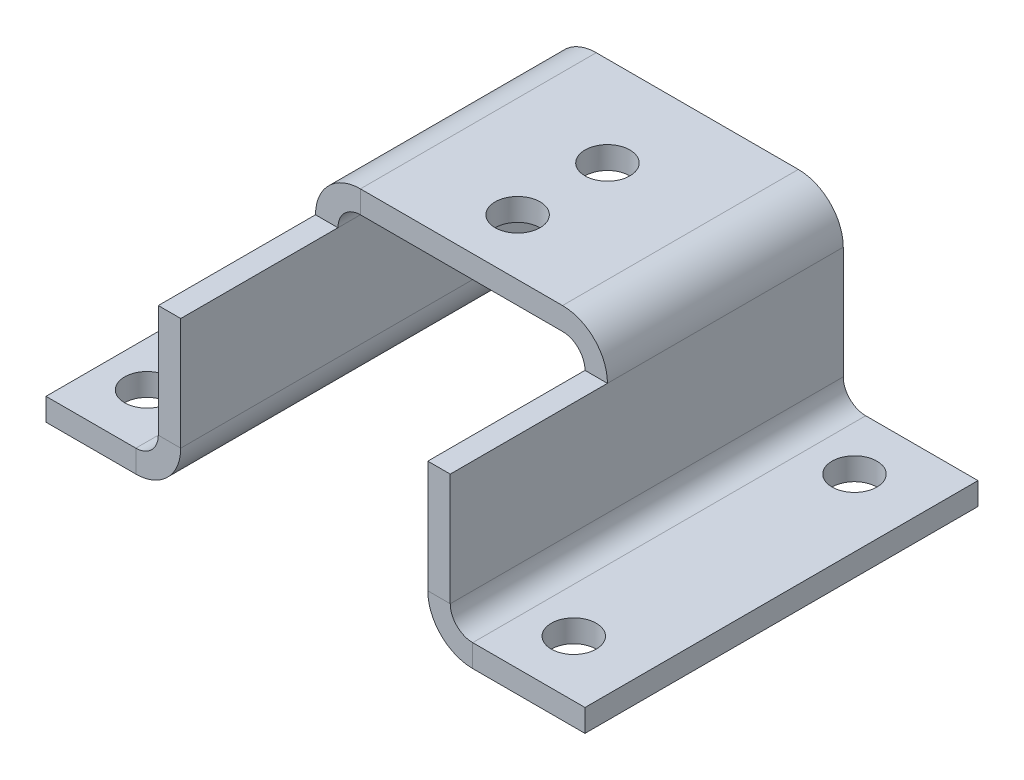
ISO-10303-21;
HEADER;
FILE_DESCRIPTION(('STEP AP214'),'2;1');
FILE_NAME('part.step','',(''),(''),'','','');
FILE_SCHEMA(('AUTOMOTIVE_DESIGN { 1 0 10303 214 1 1 1 1 }'));
ENDSEC;
DATA;
#1=APPLICATION_CONTEXT('core data for automotive mechanical design processes');
#2=APPLICATION_PROTOCOL_DEFINITION('international standard','automotive_design',2000,#1);
#3=PRODUCT_CONTEXT('',#1,'mechanical');
#4=PRODUCT('Part','Part','',(#3));
#5=PRODUCT_RELATED_PRODUCT_CATEGORY('part','',(#4));
#6=PRODUCT_DEFINITION_FORMATION('','',#4);
#7=PRODUCT_DEFINITION_CONTEXT('part definition',#1,'design');
#8=PRODUCT_DEFINITION('design','',#6,#7);
#9=PRODUCT_DEFINITION_SHAPE('','',#8);
#10=(LENGTH_UNIT() NAMED_UNIT(*) SI_UNIT(.MILLI.,.METRE.));
#11=(NAMED_UNIT(*) PLANE_ANGLE_UNIT() SI_UNIT($,.RADIAN.));
#12=(NAMED_UNIT(*) SI_UNIT($,.STERADIAN.) SOLID_ANGLE_UNIT());
#13=UNCERTAINTY_MEASURE_WITH_UNIT(LENGTH_MEASURE(1.E-05),#10,'distance_accuracy_value','');
#14=(GEOMETRIC_REPRESENTATION_CONTEXT(3) GLOBAL_UNCERTAINTY_ASSIGNED_CONTEXT((#13)) GLOBAL_UNIT_ASSIGNED_CONTEXT((#10,
#11,#12)) REPRESENTATION_CONTEXT('',''));
#15=CARTESIAN_POINT('',(0.,0.,0.));
#16=DIRECTION('',(0.,0.,1.));
#17=DIRECTION('',(1.,0.,0.));
#18=AXIS2_PLACEMENT_3D('',#15,#16,#17);
#19=CARTESIAN_POINT('',(2.00000000000001,12.,3.5));
#20=DIRECTION('',(0.,0.,-1.));
#21=DIRECTION('',(-1.,0.,0.));
#22=AXIS2_PLACEMENT_3D('',#19,#20,#21);
#23=PLANE('',#22);
#24=DIRECTION('',(-1.,0.,0.));
#25=VECTOR('',#24,1.);
#26=CARTESIAN_POINT('',(2.00000000000001,16.,3.5));
#27=LINE('',#26,#25);
#28=CARTESIAN_POINT('',(26.,16.,3.5));
#29=VERTEX_POINT('',#28);
#30=CARTESIAN_POINT('',(8.00000000000004,16.,3.5));
#31=VERTEX_POINT('',#30);
#32=EDGE_CURVE('E463',#29,#31,#27,.T.);
#33=ORIENTED_EDGE('',*,*,#32,.T.);
#34=DIRECTION('',(0.,-1.,0.));
#35=VECTOR('',#34,1.);
#36=CARTESIAN_POINT('',(8.00000000000004,16.,3.5));
#37=LINE('',#36,#35);
#38=CARTESIAN_POINT('',(8.00000000000004,14.,3.5));
#39=VERTEX_POINT('',#38);
#40=EDGE_CURVE('E13',#31,#39,#37,.T.);
#41=ORIENTED_EDGE('',*,*,#40,.T.);
#42=DIRECTION('',(1.,0.,0.));
#43=VECTOR('',#42,1.);
#44=CARTESIAN_POINT('',(0.,14.,3.5));
#45=LINE('',#44,#43);
#46=CARTESIAN_POINT('',(26.,14.,3.5));
#47=VERTEX_POINT('',#46);
#48=EDGE_CURVE('E290',#39,#47,#45,.T.);
#49=ORIENTED_EDGE('',*,*,#48,.T.);
#50=CARTESIAN_POINT('',(26.,12.,3.5));
#51=DIRECTION('',(0.,0.,-1.));
#52=DIRECTION('',(-1.,0.,0.));
#53=AXIS2_PLACEMENT_3D('',#50,#51,#52);
#54=CIRCLE('',#53,2.);
#55=CARTESIAN_POINT('',(28.0000000000001,12.,3.5));
#56=VERTEX_POINT('',#55);
#57=EDGE_CURVE('E133',#56,#47,#54,.F.);
#58=ORIENTED_EDGE('',*,*,#57,.F.);
#59=DIRECTION('',(-1.,0.,0.));
#60=VECTOR('',#59,1.);
#61=CARTESIAN_POINT('',(2.00000000000001,12.,3.5));
#62=LINE('',#61,#60);
#63=CARTESIAN_POINT('',(30.0000000000001,12.,3.5));
#64=VERTEX_POINT('',#63);
#65=EDGE_CURVE('E141',#64,#56,#62,.T.);
#66=ORIENTED_EDGE('',*,*,#65,.F.);
#67=CARTESIAN_POINT('',(26.,12.,3.5));
#68=DIRECTION('',(0.,0.,-1.));
#69=DIRECTION('',(-1.,0.,0.));
#70=AXIS2_PLACEMENT_3D('',#67,#68,#69);
#71=CIRCLE('',#70,4.);
#72=EDGE_CURVE('E286',#64,#29,#71,.F.);
#73=ORIENTED_EDGE('',*,*,#72,.T.);
#74=EDGE_LOOP('',(#33,#41,#49,#58,#66,#73));
#75=FACE_BOUND('',#74,.T.);
#76=ADVANCED_FACE('F124',(#75),#23,.F.);
#77=CARTESIAN_POINT('',(30.0000000000001,-2.,17.5));
#78=DIRECTION('',(0.,0.,-1.));
#79=DIRECTION('',(-1.,0.,0.));
#80=AXIS2_PLACEMENT_3D('',#77,#78,#79);
#81=PLANE('',#80);
#82=DIRECTION('',(-1.,0.,0.));
#83=VECTOR('',#82,1.);
#84=CARTESIAN_POINT('',(30.0000000000001,1.99999999999999,17.5));
#85=LINE('',#84,#83);
#86=CARTESIAN_POINT('',(30.0000000000001,1.99999999999999,17.5));
#87=VERTEX_POINT('',#86);
#88=CARTESIAN_POINT('',(28.0000000000001,1.99999999999999,17.5));
#89=VERTEX_POINT('',#88);
#90=EDGE_CURVE('E318',#87,#89,#85,.T.);
#91=ORIENTED_EDGE('',*,*,#90,.F.);
#92=DIRECTION('',(0.,-1.,0.));
#93=VECTOR('',#92,1.);
#94=CARTESIAN_POINT('',(30.0000000000001,1.11066371236295E-13,17.5));
#95=LINE('',#94,#93);
#96=CARTESIAN_POINT('',(30.0000000000001,12.,17.5));
#97=VERTEX_POINT('',#96);
#98=EDGE_CURVE('E522',#97,#87,#95,.T.);
#99=ORIENTED_EDGE('',*,*,#98,.F.);
#100=DIRECTION('',(-1.,0.,0.));
#101=VECTOR('',#100,1.);
#102=CARTESIAN_POINT('',(28.0000000000001,12.,17.5));
#103=LINE('',#102,#101);
#104=CARTESIAN_POINT('',(28.0000000000001,12.,17.5));
#105=VERTEX_POINT('',#104);
#106=EDGE_CURVE('E275',#105,#97,#103,.F.);
#107=ORIENTED_EDGE('',*,*,#106,.F.);
#108=DIRECTION('',(0.,1.,0.));
#109=VECTOR('',#108,1.);
#110=CARTESIAN_POINT('',(28.0000000000001,-2.00000000000001,17.5));
#111=LINE('',#110,#109);
#112=EDGE_CURVE('E280',#105,#89,#111,.F.);
#113=ORIENTED_EDGE('',*,*,#112,.T.);
#114=EDGE_LOOP('',(#91,#99,#107,#113));
#115=FACE_BOUND('',#114,.T.);
#116=ADVANCED_FACE('F531',(#115),#81,.F.);
#117=CARTESIAN_POINT('',(30.,14.,-17.5));
#118=DIRECTION('',(0.,0.,1.));
#119=DIRECTION('',(1.,0.,0.));
#120=AXIS2_PLACEMENT_3D('',#117,#118,#119);
#121=PLANE('',#120);
#122=DIRECTION('',(-1.,0.,0.));
#123=VECTOR('',#122,1.);
#124=CARTESIAN_POINT('',(30.0000000000001,1.99999999999999,-17.5));
#125=LINE('',#124,#123);
#126=CARTESIAN_POINT('',(30.0000000000001,1.99999999999999,-17.5));
#127=VERTEX_POINT('',#126);
#128=CARTESIAN_POINT('',(28.0000000000001,1.99999999999998,-17.5));
#129=VERTEX_POINT('',#128);
#130=EDGE_CURVE('E508',#127,#129,#125,.T.);
#131=ORIENTED_EDGE('',*,*,#130,.T.);
#132=DIRECTION('',(0.,-1.,0.));
#133=VECTOR('',#132,1.);
#134=CARTESIAN_POINT('',(28.,14.,-17.5));
#135=LINE('',#134,#133);
#136=CARTESIAN_POINT('',(28.0000000000001,12.,-17.5));
#137=VERTEX_POINT('',#136);
#138=EDGE_CURVE('E523',#129,#137,#135,.F.);
#139=ORIENTED_EDGE('',*,*,#138,.T.);
#140=DIRECTION('',(-1.,0.,0.));
#141=VECTOR('',#140,1.);
#142=CARTESIAN_POINT('',(30.0000000000001,12.,-17.5));
#143=LINE('',#142,#141);
#144=CARTESIAN_POINT('',(30.0000000000001,12.,-17.5));
#145=VERTEX_POINT('',#144);
#146=EDGE_CURVE('E315',#137,#145,#143,.F.);
#147=ORIENTED_EDGE('',*,*,#146,.T.);
#148=DIRECTION('',(0.,1.,0.));
#149=VECTOR('',#148,1.);
#150=CARTESIAN_POINT('',(30.0000000000001,1.11066371236295E-13,-17.5));
#151=LINE('',#150,#149);
#152=EDGE_CURVE('E305',#127,#145,#151,.T.);
#153=ORIENTED_EDGE('',*,*,#152,.F.);
#154=EDGE_LOOP('',(#131,#139,#147,#153));
#155=FACE_BOUND('',#154,.T.);
#156=ADVANCED_FACE('F541',(#155),#121,.F.);
#157=CARTESIAN_POINT('',(30.0000000000001,1.11066371236295E-13,0.));
#158=DIRECTION('',(-1.,0.,0.));
#159=DIRECTION('',(0.,-1.,0.));
#160=AXIS2_PLACEMENT_3D('',#157,#158,#159);
#161=PLANE('',#160);
#162=DIRECTION('',(0.,0.,-1.));
#163=VECTOR('',#162,1.);
#164=CARTESIAN_POINT('',(30.0000000000001,1.99999999999999,-17.5));
#165=LINE('',#164,#163);
#166=EDGE_CURVE('E514',#127,#87,#165,.F.);
#167=ORIENTED_EDGE('',*,*,#166,.F.);
#168=ORIENTED_EDGE('',*,*,#152,.T.);
#169=DIRECTION('',(0.,0.,1.));
#170=VECTOR('',#169,1.);
#171=CARTESIAN_POINT('',(30.0000000000001,12.,-17.5));
#172=LINE('',#171,#170);
#173=EDGE_CURVE('E281',#64,#145,#172,.F.);
#174=ORIENTED_EDGE('',*,*,#173,.F.);
#175=EDGE_CURVE('E272',#97,#64,#172,.F.);
#176=ORIENTED_EDGE('',*,*,#175,.F.);
#177=ORIENTED_EDGE('',*,*,#98,.T.);
#178=EDGE_LOOP('',(#167,#168,#174,#176,#177));
#179=FACE_BOUND('',#178,.T.);
#180=ADVANCED_FACE('F303',(#179),#161,.F.);
#181=CARTESIAN_POINT('',(28.0000000000001,1.04083408558609E-13,0.));
#182=DIRECTION('',(-1.,0.,0.));
#183=DIRECTION('',(0.,-1.,0.));
#184=AXIS2_PLACEMENT_3D('',#181,#182,#183);
#185=PLANE('',#184);
#186=ORIENTED_EDGE('',*,*,#138,.F.);
#187=DIRECTION('',(0.,0.,-1.));
#188=VECTOR('',#187,1.);
#189=CARTESIAN_POINT('',(28.0000000000001,1.99999999999998,-17.5));
#190=LINE('',#189,#188);
#191=EDGE_CURVE('E503',#129,#89,#190,.F.);
#192=ORIENTED_EDGE('',*,*,#191,.T.);
#193=ORIENTED_EDGE('',*,*,#112,.F.);
#194=DIRECTION('',(0.,0.,1.));
#195=VECTOR('',#194,1.);
#196=CARTESIAN_POINT('',(28.0000000000001,12.,-17.5));
#197=LINE('',#196,#195);
#198=EDGE_CURVE('E314',#56,#105,#197,.T.);
#199=ORIENTED_EDGE('',*,*,#198,.F.);
#200=EDGE_CURVE('E307',#137,#56,#197,.T.);
#201=ORIENTED_EDGE('',*,*,#200,.F.);
#202=EDGE_LOOP('',(#186,#192,#193,#199,#201));
#203=FACE_BOUND('',#202,.T.);
#204=ADVANCED_FACE('F533',(#203),#185,.T.);
#205=CARTESIAN_POINT('',(6.00000000000005,16.,-17.5));
#206=DIRECTION('',(0.,0.,1.));
#207=DIRECTION('',(1.,0.,0.));
#208=AXIS2_PLACEMENT_3D('',#205,#206,#207);
#209=PLANE('',#208);
#210=DIRECTION('',(0.,1.,0.));
#211=VECTOR('',#210,1.);
#212=CARTESIAN_POINT('',(26.,14.,-17.5));
#213=LINE('',#212,#211);
#214=CARTESIAN_POINT('',(26.,14.,-17.5));
#215=VERTEX_POINT('',#214);
#216=CARTESIAN_POINT('',(26.,16.,-17.5));
#217=VERTEX_POINT('',#216);
#218=EDGE_CURVE('E323',#215,#217,#213,.T.);
#219=ORIENTED_EDGE('',*,*,#218,.F.);
#220=DIRECTION('',(1.,0.,0.));
#221=VECTOR('',#220,1.);
#222=CARTESIAN_POINT('',(6.00000000000005,14.,-17.5));
#223=LINE('',#222,#221);
#224=CARTESIAN_POINT('',(8.00000000000004,14.,-17.5));
#225=VERTEX_POINT('',#224);
#226=EDGE_CURVE('E335',#215,#225,#223,.F.);
#227=ORIENTED_EDGE('',*,*,#226,.T.);
#228=DIRECTION('',(0.,-1.,0.));
#229=VECTOR('',#228,1.);
#230=CARTESIAN_POINT('',(8.00000000000004,16.,-17.5));
#231=LINE('',#230,#229);
#232=CARTESIAN_POINT('',(8.00000000000004,16.,-17.5));
#233=VERTEX_POINT('',#232);
#234=EDGE_CURVE('E330',#225,#233,#231,.F.);
#235=ORIENTED_EDGE('',*,*,#234,.T.);
#236=DIRECTION('',(-1.,0.,0.));
#237=VECTOR('',#236,1.);
#238=CARTESIAN_POINT('',(0.,16.,-17.5));
#239=LINE('',#238,#237);
#240=EDGE_CURVE('E331',#217,#233,#239,.T.);
#241=ORIENTED_EDGE('',*,*,#240,.F.);
#242=EDGE_LOOP('',(#219,#227,#235,#241));
#243=FACE_BOUND('',#242,.T.);
#244=ADVANCED_FACE('F554',(#243),#209,.F.);
#245=CARTESIAN_POINT('',(0.,16.,0.));
#246=DIRECTION('',(0.,-1.,0.));
#247=DIRECTION('',(0.,0.,-1.));
#248=AXIS2_PLACEMENT_3D('',#245,#246,#247);
#249=PLANE('',#248);
#250=CARTESIAN_POINT('',(17.,16.,-9.5));
#251=DIRECTION('',(0.,1.,0.));
#252=DIRECTION('',(0.,0.,1.));
#253=AXIS2_PLACEMENT_3D('',#250,#251,#252);
#254=CIRCLE('',#253,2.);
#255=CARTESIAN_POINT('',(17.,16.,-7.5));
#256=VERTEX_POINT('',#255);
#257=EDGE_CURVE('E429',#256,#256,#254,.T.);
#258=ORIENTED_EDGE('',*,*,#257,.F.);
#259=EDGE_LOOP('',(#258));
#260=FACE_BOUND('',#259,.T.);
#261=CARTESIAN_POINT('',(17.,16.,-1.5));
#262=DIRECTION('',(0.,1.,0.));
#263=DIRECTION('',(0.,0.,1.));
#264=AXIS2_PLACEMENT_3D('',#261,#262,#263);
#265=CIRCLE('',#264,2.);
#266=CARTESIAN_POINT('',(17.,16.,0.500000000000002));
#267=VERTEX_POINT('',#266);
#268=EDGE_CURVE('E435',#267,#267,#265,.T.);
#269=ORIENTED_EDGE('',*,*,#268,.F.);
#270=EDGE_LOOP('',(#269));
#271=FACE_BOUND('',#270,.T.);
#272=DIRECTION('',(0.,0.,1.));
#273=VECTOR('',#272,1.);
#274=CARTESIAN_POINT('',(8.00000000000004,16.,-17.5));
#275=LINE('',#274,#273);
#276=EDGE_CURVE('E337',#31,#233,#275,.F.);
#277=ORIENTED_EDGE('',*,*,#276,.F.);
#278=ORIENTED_EDGE('',*,*,#32,.F.);
#279=DIRECTION('',(0.,0.,1.));
#280=VECTOR('',#279,1.);
#281=CARTESIAN_POINT('',(26.,16.,17.5));
#282=LINE('',#281,#280);
#283=EDGE_CURVE('E298',#29,#217,#282,.F.);
#284=ORIENTED_EDGE('',*,*,#283,.T.);
#285=ORIENTED_EDGE('',*,*,#240,.T.);
#286=EDGE_LOOP('',(#277,#278,#284,#285));
#287=FACE_BOUND('',#286,.T.);
#288=ADVANCED_FACE('F654',(#260,#271,#287),#249,.F.);
#289=CARTESIAN_POINT('',(0.,14.,0.));
#290=DIRECTION('',(0.,-1.,0.));
#291=DIRECTION('',(0.,0.,-1.));
#292=AXIS2_PLACEMENT_3D('',#289,#290,#291);
#293=PLANE('',#292);
#294=CARTESIAN_POINT('',(17.,14.,-9.5));
#295=DIRECTION('',(0.,-1.,0.));
#296=DIRECTION('',(0.,0.,-1.));
#297=AXIS2_PLACEMENT_3D('',#294,#295,#296);
#298=CIRCLE('',#297,2.);
#299=CARTESIAN_POINT('',(17.,14.,-11.5));
#300=VERTEX_POINT('',#299);
#301=EDGE_CURVE('E128',#300,#300,#298,.T.);
#302=ORIENTED_EDGE('',*,*,#301,.F.);
#303=EDGE_LOOP('',(#302));
#304=FACE_BOUND('',#303,.T.);
#305=CARTESIAN_POINT('',(17.,14.,-1.5));
#306=DIRECTION('',(0.,-1.,0.));
#307=DIRECTION('',(0.,0.,-1.));
#308=AXIS2_PLACEMENT_3D('',#305,#306,#307);
#309=CIRCLE('',#308,2.);
#310=CARTESIAN_POINT('',(17.,14.,-3.5));
#311=VERTEX_POINT('',#310);
#312=EDGE_CURVE('E427',#311,#311,#309,.T.);
#313=ORIENTED_EDGE('',*,*,#312,.F.);
#314=EDGE_LOOP('',(#313));
#315=FACE_BOUND('',#314,.T.);
#316=ORIENTED_EDGE('',*,*,#48,.F.);
#317=DIRECTION('',(0.,0.,1.));
#318=VECTOR('',#317,1.);
#319=CARTESIAN_POINT('',(8.00000000000004,14.,-17.5));
#320=LINE('',#319,#318);
#321=EDGE_CURVE('E339',#225,#39,#320,.T.);
#322=ORIENTED_EDGE('',*,*,#321,.F.);
#323=ORIENTED_EDGE('',*,*,#226,.F.);
#324=DIRECTION('',(0.,0.,1.));
#325=VECTOR('',#324,1.);
#326=CARTESIAN_POINT('',(26.,14.,17.5));
#327=LINE('',#326,#325);
#328=EDGE_CURVE('E326',#47,#215,#327,.F.);
#329=ORIENTED_EDGE('',*,*,#328,.F.);
#330=EDGE_LOOP('',(#316,#322,#323,#329));
#331=FACE_BOUND('',#330,.T.);
#332=ADVANCED_FACE('F557',(#304,#315,#331),#293,.T.);
#333=CARTESIAN_POINT('',(6.,0.,17.5));
#334=DIRECTION('',(0.,0.,-1.));
#335=DIRECTION('',(-1.,0.,0.));
#336=AXIS2_PLACEMENT_3D('',#333,#334,#335);
#337=PLANE('',#336);
#338=DIRECTION('',(-1.,0.,0.));
#339=VECTOR('',#338,1.);
#340=CARTESIAN_POINT('',(6.00000000000004,12.,17.5));
#341=LINE('',#340,#339);
#342=CARTESIAN_POINT('',(6.00000000000004,12.,17.5));
#343=VERTEX_POINT('',#342);
#344=CARTESIAN_POINT('',(4.00000000000004,12.,17.5));
#345=VERTEX_POINT('',#344);
#346=EDGE_CURVE('E351',#343,#345,#341,.T.);
#347=ORIENTED_EDGE('',*,*,#346,.T.);
#348=DIRECTION('',(0.,1.,0.));
#349=VECTOR('',#348,1.);
#350=CARTESIAN_POINT('',(4.,0.,17.5));
#351=LINE('',#350,#349);
#352=CARTESIAN_POINT('',(4.00000000000001,1.99999999999999,17.5));
#353=VERTEX_POINT('',#352);
#354=EDGE_CURVE('E372',#345,#353,#351,.F.);
#355=ORIENTED_EDGE('',*,*,#354,.T.);
#356=DIRECTION('',(-1.,0.,0.));
#357=VECTOR('',#356,1.);
#358=CARTESIAN_POINT('',(6.00000000000001,1.99999999999999,17.5));
#359=LINE('',#358,#357);
#360=CARTESIAN_POINT('',(6.00000000000001,1.99999999999999,17.5));
#361=VERTEX_POINT('',#360);
#362=EDGE_CURVE('E360',#353,#361,#359,.F.);
#363=ORIENTED_EDGE('',*,*,#362,.T.);
#364=DIRECTION('',(0.,-1.,0.));
#365=VECTOR('',#364,1.);
#366=CARTESIAN_POINT('',(6.,0.,17.5));
#367=LINE('',#366,#365);
#368=EDGE_CURVE('E367',#343,#361,#367,.T.);
#369=ORIENTED_EDGE('',*,*,#368,.F.);
#370=EDGE_LOOP('',(#347,#355,#363,#369));
#371=FACE_BOUND('',#370,.T.);
#372=ADVANCED_FACE('F585',(#371),#337,.F.);
#373=CARTESIAN_POINT('',(6.00000000000006,16.,-17.5));
#374=DIRECTION('',(0.,0.,1.));
#375=DIRECTION('',(1.,0.,0.));
#376=AXIS2_PLACEMENT_3D('',#373,#374,#375);
#377=PLANE('',#376);
#378=DIRECTION('',(-1.,0.,0.));
#379=VECTOR('',#378,1.);
#380=CARTESIAN_POINT('',(6.00000000000004,12.,-17.5));
#381=LINE('',#380,#379);
#382=CARTESIAN_POINT('',(6.00000000000004,12.,-17.5));
#383=VERTEX_POINT('',#382);
#384=CARTESIAN_POINT('',(4.00000000000004,12.,-17.5));
#385=VERTEX_POINT('',#384);
#386=EDGE_CURVE('E357',#383,#385,#381,.T.);
#387=ORIENTED_EDGE('',*,*,#386,.F.);
#388=DIRECTION('',(0.,1.,0.));
#389=VECTOR('',#388,1.);
#390=CARTESIAN_POINT('',(6.,0.,-17.5));
#391=LINE('',#390,#389);
#392=CARTESIAN_POINT('',(6.00000000000001,1.99999999999999,-17.5));
#393=VERTEX_POINT('',#392);
#394=EDGE_CURVE('E363',#393,#383,#391,.T.);
#395=ORIENTED_EDGE('',*,*,#394,.F.);
#396=DIRECTION('',(-1.,0.,0.));
#397=VECTOR('',#396,1.);
#398=CARTESIAN_POINT('',(4.00000000000001,1.99999999999999,-17.5));
#399=LINE('',#398,#397);
#400=CARTESIAN_POINT('',(4.00000000000001,1.99999999999999,-17.5));
#401=VERTEX_POINT('',#400);
#402=EDGE_CURVE('E377',#401,#393,#399,.F.);
#403=ORIENTED_EDGE('',*,*,#402,.F.);
#404=DIRECTION('',(0.,-1.,0.));
#405=VECTOR('',#404,1.);
#406=CARTESIAN_POINT('',(4.00000000000006,16.,-17.5));
#407=LINE('',#406,#405);
#408=EDGE_CURVE('E369',#401,#385,#407,.F.);
#409=ORIENTED_EDGE('',*,*,#408,.T.);
#410=EDGE_LOOP('',(#387,#395,#403,#409));
#411=FACE_BOUND('',#410,.T.);
#412=ADVANCED_FACE('F568',(#411),#377,.F.);
#413=CARTESIAN_POINT('',(6.,0.,0.));
#414=DIRECTION('',(-1.,0.,0.));
#415=DIRECTION('',(0.,-1.,0.));
#416=AXIS2_PLACEMENT_3D('',#413,#414,#415);
#417=PLANE('',#416);
#418=DIRECTION('',(0.,0.,1.));
#419=VECTOR('',#418,1.);
#420=CARTESIAN_POINT('',(6.00000000000004,12.,17.5));
#421=LINE('',#420,#419);
#422=CARTESIAN_POINT('',(6.00000000000004,12.,3.5));
#423=VERTEX_POINT('',#422);
#424=EDGE_CURVE('E355',#343,#423,#421,.F.);
#425=ORIENTED_EDGE('',*,*,#424,.F.);
#426=ORIENTED_EDGE('',*,*,#368,.T.);
#427=DIRECTION('',(0.,0.,-1.));
#428=VECTOR('',#427,1.);
#429=CARTESIAN_POINT('',(6.00000000000001,1.99999999999999,17.5));
#430=LINE('',#429,#428);
#431=EDGE_CURVE('E374',#393,#361,#430,.F.);
#432=ORIENTED_EDGE('',*,*,#431,.F.);
#433=ORIENTED_EDGE('',*,*,#394,.T.);
#434=EDGE_CURVE('E334',#423,#383,#421,.F.);
#435=ORIENTED_EDGE('',*,*,#434,.F.);
#436=EDGE_LOOP('',(#425,#426,#432,#433,#435));
#437=FACE_BOUND('',#436,.T.);
#438=ADVANCED_FACE('F574',(#437),#417,.F.);
#439=CARTESIAN_POINT('',(4.,0.,0.));
#440=DIRECTION('',(-1.,0.,0.));
#441=DIRECTION('',(0.,-1.,0.));
#442=AXIS2_PLACEMENT_3D('',#439,#440,#441);
#443=PLANE('',#442);
#444=ORIENTED_EDGE('',*,*,#354,.F.);
#445=DIRECTION('',(0.,0.,1.));
#446=VECTOR('',#445,1.);
#447=CARTESIAN_POINT('',(4.00000000000004,12.,17.5));
#448=LINE('',#447,#446);
#449=CARTESIAN_POINT('',(4.00000000000004,12.,3.5));
#450=VERTEX_POINT('',#449);
#451=EDGE_CURVE('E344',#345,#450,#448,.F.);
#452=ORIENTED_EDGE('',*,*,#451,.T.);
#453=EDGE_CURVE('E348',#450,#385,#448,.F.);
#454=ORIENTED_EDGE('',*,*,#453,.T.);
#455=ORIENTED_EDGE('',*,*,#408,.F.);
#456=DIRECTION('',(0.,0.,-1.));
#457=VECTOR('',#456,1.);
#458=CARTESIAN_POINT('',(4.00000000000001,1.99999999999999,17.5));
#459=LINE('',#458,#457);
#460=EDGE_CURVE('E380',#353,#401,#459,.T.);
#461=ORIENTED_EDGE('',*,*,#460,.F.);
#462=EDGE_LOOP('',(#444,#452,#454,#455,#461));
#463=FACE_BOUND('',#462,.T.);
#464=ADVANCED_FACE('F589',(#463),#443,.T.);
#465=CARTESIAN_POINT('',(6.,-2.,-17.5));
#466=DIRECTION('',(0.,0.,-1.));
#467=DIRECTION('',(-1.,0.,0.));
#468=AXIS2_PLACEMENT_3D('',#465,#466,#467);
#469=PLANE('',#468);
#470=DIRECTION('',(-1.,0.,0.));
#471=VECTOR('',#470,1.);
#472=CARTESIAN_POINT('',(6.,0.,-17.5));
#473=LINE('',#472,#471);
#474=CARTESIAN_POINT('',(2.00000000000001,0.,-17.5));
#475=VERTEX_POINT('',#474);
#476=CARTESIAN_POINT('',(-6.,0.,-17.5));
#477=VERTEX_POINT('',#476);
#478=EDGE_CURVE('E411',#475,#477,#473,.T.);
#479=ORIENTED_EDGE('',*,*,#478,.F.);
#480=DIRECTION('',(0.,-1.,0.));
#481=VECTOR('',#480,1.);
#482=CARTESIAN_POINT('',(2.00000000000001,0.,-17.5));
#483=LINE('',#482,#481);
#484=CARTESIAN_POINT('',(2.00000000000001,-2.,-17.5));
#485=VERTEX_POINT('',#484);
#486=EDGE_CURVE('E390',#475,#485,#483,.T.);
#487=ORIENTED_EDGE('',*,*,#486,.T.);
#488=DIRECTION('',(-1.,0.,0.));
#489=VECTOR('',#488,1.);
#490=CARTESIAN_POINT('',(6.,-2.,-17.5));
#491=LINE('',#490,#489);
#492=CARTESIAN_POINT('',(-6.,-2.,-17.5));
#493=VERTEX_POINT('',#492);
#494=EDGE_CURVE('E414',#485,#493,#491,.T.);
#495=ORIENTED_EDGE('',*,*,#494,.T.);
#496=DIRECTION('',(0.,1.,0.));
#497=VECTOR('',#496,1.);
#498=CARTESIAN_POINT('',(-6.,-2.,-17.5));
#499=LINE('',#498,#497);
#500=EDGE_CURVE('E423',#493,#477,#499,.T.);
#501=ORIENTED_EDGE('',*,*,#500,.T.);
#502=EDGE_LOOP('',(#479,#487,#495,#501));
#503=FACE_BOUND('',#502,.T.);
#504=ADVANCED_FACE('F598',(#503),#469,.T.);
#505=CARTESIAN_POINT('',(0.,-2.,0.));
#506=DIRECTION('',(0.,1.,0.));
#507=DIRECTION('',(0.,0.,1.));
#508=AXIS2_PLACEMENT_3D('',#505,#506,#507);
#509=PLANE('',#508);
#510=CARTESIAN_POINT('',(-1.99999999999999,-2.,12.5));
#511=DIRECTION('',(0.,1.,0.));
#512=DIRECTION('',(0.,0.,1.));
#513=AXIS2_PLACEMENT_3D('',#510,#511,#512);
#514=CIRCLE('',#513,2.);
#515=CARTESIAN_POINT('',(-1.99999999999999,-2.,14.5));
#516=VERTEX_POINT('',#515);
#517=EDGE_CURVE('E448',#516,#516,#514,.T.);
#518=ORIENTED_EDGE('',*,*,#517,.T.);
#519=EDGE_LOOP('',(#518));
#520=FACE_BOUND('',#519,.T.);
#521=CARTESIAN_POINT('',(-2.,-2.,-12.5));
#522=DIRECTION('',(0.,1.,0.));
#523=DIRECTION('',(0.,0.,1.));
#524=AXIS2_PLACEMENT_3D('',#521,#522,#523);
#525=CIRCLE('',#524,2.);
#526=CARTESIAN_POINT('',(-2.,-2.,-10.5));
#527=VERTEX_POINT('',#526);
#528=EDGE_CURVE('E460',#527,#527,#525,.T.);
#529=ORIENTED_EDGE('',*,*,#528,.T.);
#530=EDGE_LOOP('',(#529));
#531=FACE_BOUND('',#530,.T.);
#532=DIRECTION('',(0.,0.,-1.));
#533=VECTOR('',#532,1.);
#534=CARTESIAN_POINT('',(2.00000000000001,-2.,-17.5));
#535=LINE('',#534,#533);
#536=CARTESIAN_POINT('',(2.00000000000001,-2.,17.5));
#537=VERTEX_POINT('',#536);
#538=EDGE_CURVE('E384',#485,#537,#535,.F.);
#539=ORIENTED_EDGE('',*,*,#538,.T.);
#540=DIRECTION('',(1.,0.,0.));
#541=VECTOR('',#540,1.);
#542=CARTESIAN_POINT('',(6.,-2.,17.5));
#543=LINE('',#542,#541);
#544=CARTESIAN_POINT('',(-6.,-2.,17.5));
#545=VERTEX_POINT('',#544);
#546=EDGE_CURVE('E410',#545,#537,#543,.T.);
#547=ORIENTED_EDGE('',*,*,#546,.F.);
#548=DIRECTION('',(0.,0.,1.));
#549=VECTOR('',#548,1.);
#550=CARTESIAN_POINT('',(-6.,-2.,17.5));
#551=LINE('',#550,#549);
#552=EDGE_CURVE('E407',#493,#545,#551,.T.);
#553=ORIENTED_EDGE('',*,*,#552,.F.);
#554=ORIENTED_EDGE('',*,*,#494,.F.);
#555=EDGE_LOOP('',(#539,#547,#553,#554));
#556=FACE_BOUND('',#555,.T.);
#557=ADVANCED_FACE('F602',(#520,#531,#556),#509,.F.);
#558=CARTESIAN_POINT('',(0.,0.,0.));
#559=DIRECTION('',(0.,1.,0.));
#560=DIRECTION('',(0.,0.,1.));
#561=AXIS2_PLACEMENT_3D('',#558,#559,#560);
#562=PLANE('',#561);
#563=CARTESIAN_POINT('',(-1.99999999999999,0.,12.5));
#564=DIRECTION('',(0.,1.,0.));
#565=DIRECTION('',(0.,0.,1.));
#566=AXIS2_PLACEMENT_3D('',#563,#564,#565);
#567=CIRCLE('',#566,2.);
#568=CARTESIAN_POINT('',(-1.99999999999999,0.,14.5));
#569=VERTEX_POINT('',#568);
#570=EDGE_CURVE('E452',#569,#569,#567,.T.);
#571=ORIENTED_EDGE('',*,*,#570,.F.);
#572=EDGE_LOOP('',(#571));
#573=FACE_BOUND('',#572,.T.);
#574=CARTESIAN_POINT('',(-2.,0.,-12.5));
#575=DIRECTION('',(0.,1.,0.));
#576=DIRECTION('',(0.,0.,1.));
#577=AXIS2_PLACEMENT_3D('',#574,#575,#576);
#578=CIRCLE('',#577,2.);
#579=CARTESIAN_POINT('',(-2.,0.,-10.5));
#580=VERTEX_POINT('',#579);
#581=EDGE_CURVE('E451',#580,#580,#578,.T.);
#582=ORIENTED_EDGE('',*,*,#581,.F.);
#583=EDGE_LOOP('',(#582));
#584=FACE_BOUND('',#583,.T.);
#585=DIRECTION('',(1.,0.,0.));
#586=VECTOR('',#585,1.);
#587=CARTESIAN_POINT('',(6.,0.,17.5));
#588=LINE('',#587,#586);
#589=CARTESIAN_POINT('',(-6.,0.,17.5));
#590=VERTEX_POINT('',#589);
#591=CARTESIAN_POINT('',(2.00000000000001,0.,17.5));
#592=VERTEX_POINT('',#591);
#593=EDGE_CURVE('E419',#590,#592,#588,.T.);
#594=ORIENTED_EDGE('',*,*,#593,.T.);
#595=DIRECTION('',(0.,0.,-1.));
#596=VECTOR('',#595,1.);
#597=CARTESIAN_POINT('',(2.00000000000001,0.,-17.5));
#598=LINE('',#597,#596);
#599=EDGE_CURVE('E396',#475,#592,#598,.F.);
#600=ORIENTED_EDGE('',*,*,#599,.F.);
#601=ORIENTED_EDGE('',*,*,#478,.T.);
#602=DIRECTION('',(0.,0.,1.));
#603=VECTOR('',#602,1.);
#604=CARTESIAN_POINT('',(-6.,0.,17.5));
#605=LINE('',#604,#603);
#606=EDGE_CURVE('E404',#477,#590,#605,.T.);
#607=ORIENTED_EDGE('',*,*,#606,.T.);
#608=EDGE_LOOP('',(#594,#600,#601,#607));
#609=FACE_BOUND('',#608,.T.);
#610=ADVANCED_FACE('F610',(#573,#584,#609),#562,.T.);
#611=CARTESIAN_POINT('',(-6.,-2.,17.5));
#612=DIRECTION('',(-1.,0.,0.));
#613=DIRECTION('',(0.,0.,1.));
#614=AXIS2_PLACEMENT_3D('',#611,#612,#613);
#615=PLANE('',#614);
#616=ORIENTED_EDGE('',*,*,#606,.F.);
#617=ORIENTED_EDGE('',*,*,#500,.F.);
#618=ORIENTED_EDGE('',*,*,#552,.T.);
#619=DIRECTION('',(0.,1.,0.));
#620=VECTOR('',#619,1.);
#621=CARTESIAN_POINT('',(-6.,-2.,17.5));
#622=LINE('',#621,#620);
#623=EDGE_CURVE('E416',#545,#590,#622,.T.);
#624=ORIENTED_EDGE('',*,*,#623,.T.);
#625=EDGE_LOOP('',(#616,#617,#618,#624));
#626=FACE_BOUND('',#625,.T.);
#627=ADVANCED_FACE('F126',(#626),#615,.T.);
#628=CARTESIAN_POINT('',(6.,-2.,17.5));
#629=DIRECTION('',(0.,0.,1.));
#630=DIRECTION('',(1.,0.,0.));
#631=AXIS2_PLACEMENT_3D('',#628,#629,#630);
#632=PLANE('',#631);
#633=DIRECTION('',(0.,-1.,0.));
#634=VECTOR('',#633,1.);
#635=CARTESIAN_POINT('',(2.00000000000001,0.,17.5));
#636=LINE('',#635,#634);
#637=EDGE_CURVE('E401',#592,#537,#636,.T.);
#638=ORIENTED_EDGE('',*,*,#637,.F.);
#639=ORIENTED_EDGE('',*,*,#593,.F.);
#640=ORIENTED_EDGE('',*,*,#623,.F.);
#641=ORIENTED_EDGE('',*,*,#546,.T.);
#642=EDGE_LOOP('',(#638,#639,#640,#641));
#643=FACE_BOUND('',#642,.T.);
#644=ADVANCED_FACE('F605',(#643),#632,.T.);
#645=CARTESIAN_POINT('',(2.00000000000001,2.,17.5));
#646=DIRECTION('',(0.,0.,1.));
#647=DIRECTION('',(1.,0.,0.));
#648=AXIS2_PLACEMENT_3D('',#645,#646,#647);
#649=PLANE('',#648);
#650=ORIENTED_EDGE('',*,*,#362,.F.);
#651=CARTESIAN_POINT('',(2.00000000000001,2.,17.5));
#652=DIRECTION('',(0.,0.,-1.));
#653=DIRECTION('',(-1.,0.,0.));
#654=AXIS2_PLACEMENT_3D('',#651,#652,#653);
#655=CIRCLE('',#654,2.);
#656=EDGE_CURVE('E393',#592,#353,#655,.F.);
#657=ORIENTED_EDGE('',*,*,#656,.F.);
#658=ORIENTED_EDGE('',*,*,#637,.T.);
#659=CARTESIAN_POINT('',(2.00000000000001,2.,17.5));
#660=DIRECTION('',(0.,0.,-1.));
#661=DIRECTION('',(-1.,0.,0.));
#662=AXIS2_PLACEMENT_3D('',#659,#660,#661);
#663=CIRCLE('',#662,4.);
#664=EDGE_CURVE('E386',#537,#361,#663,.F.);
#665=ORIENTED_EDGE('',*,*,#664,.T.);
#666=EDGE_LOOP('',(#650,#657,#658,#665));
#667=FACE_BOUND('',#666,.T.);
#668=ADVANCED_FACE('F582',(#667),#649,.T.);
#669=CARTESIAN_POINT('',(2.00000000000001,2.,-17.5));
#670=DIRECTION('',(0.,0.,1.));
#671=DIRECTION('',(1.,0.,0.));
#672=AXIS2_PLACEMENT_3D('',#669,#670,#671);
#673=PLANE('',#672);
#674=CARTESIAN_POINT('',(2.00000000000001,2.,-17.5));
#675=DIRECTION('',(0.,0.,-1.));
#676=DIRECTION('',(-1.,0.,0.));
#677=AXIS2_PLACEMENT_3D('',#674,#675,#676);
#678=CIRCLE('',#677,2.);
#679=EDGE_CURVE('E366',#401,#475,#678,.T.);
#680=ORIENTED_EDGE('',*,*,#679,.F.);
#681=ORIENTED_EDGE('',*,*,#402,.T.);
#682=CARTESIAN_POINT('',(2.00000000000001,2.,-17.5));
#683=DIRECTION('',(0.,0.,-1.));
#684=DIRECTION('',(-1.,0.,0.));
#685=AXIS2_PLACEMENT_3D('',#682,#683,#684);
#686=CIRCLE('',#685,4.);
#687=EDGE_CURVE('E387',#393,#485,#686,.T.);
#688=ORIENTED_EDGE('',*,*,#687,.T.);
#689=ORIENTED_EDGE('',*,*,#486,.F.);
#690=EDGE_LOOP('',(#680,#681,#688,#689));
#691=FACE_BOUND('',#690,.T.);
#692=ADVANCED_FACE('F595',(#691),#673,.F.);
#693=CARTESIAN_POINT('',(2.00000000000001,2.,-17.5));
#694=DIRECTION('',(0.,0.,-1.));
#695=DIRECTION('',(1.,0.,0.));
#696=AXIS2_PLACEMENT_3D('',#693,#694,#695);
#697=CYLINDRICAL_SURFACE('',#696,4.);
#698=ORIENTED_EDGE('',*,*,#538,.F.);
#699=ORIENTED_EDGE('',*,*,#687,.F.);
#700=ORIENTED_EDGE('',*,*,#431,.T.);
#701=ORIENTED_EDGE('',*,*,#664,.F.);
#702=EDGE_LOOP('',(#698,#699,#700,#701));
#703=FACE_BOUND('',#702,.T.);
#704=ADVANCED_FACE('F579',(#703),#697,.T.);
#705=CARTESIAN_POINT('',(2.00000000000001,2.,-17.5));
#706=DIRECTION('',(0.,0.,-1.));
#707=DIRECTION('',(1.,0.,0.));
#708=AXIS2_PLACEMENT_3D('',#705,#706,#707);
#709=CYLINDRICAL_SURFACE('',#708,2.);
#710=ORIENTED_EDGE('',*,*,#599,.T.);
#711=ORIENTED_EDGE('',*,*,#656,.T.);
#712=ORIENTED_EDGE('',*,*,#460,.T.);
#713=ORIENTED_EDGE('',*,*,#679,.T.);
#714=EDGE_LOOP('',(#710,#711,#712,#713));
#715=FACE_BOUND('',#714,.T.);
#716=ADVANCED_FACE('F592',(#715),#709,.F.);
#717=CARTESIAN_POINT('',(8.00000000000004,12.,-17.5));
#718=DIRECTION('',(0.,0.,-1.));
#719=DIRECTION('',(-1.,0.,0.));
#720=AXIS2_PLACEMENT_3D('',#717,#718,#719);
#721=PLANE('',#720);
#722=ORIENTED_EDGE('',*,*,#234,.F.);
#723=CARTESIAN_POINT('',(8.00000000000004,12.,-17.5));
#724=DIRECTION('',(0.,0.,1.));
#725=DIRECTION('',(1.,0.,0.));
#726=AXIS2_PLACEMENT_3D('',#723,#724,#725);
#727=CIRCLE('',#726,2.);
#728=EDGE_CURVE('E352',#383,#225,#727,.F.);
#729=ORIENTED_EDGE('',*,*,#728,.F.);
#730=ORIENTED_EDGE('',*,*,#386,.T.);
#731=CARTESIAN_POINT('',(8.00000000000004,12.,-17.5));
#732=DIRECTION('',(0.,0.,1.));
#733=DIRECTION('',(1.,0.,0.));
#734=AXIS2_PLACEMENT_3D('',#731,#732,#733);
#735=CIRCLE('',#734,4.);
#736=EDGE_CURVE('E347',#385,#233,#735,.F.);
#737=ORIENTED_EDGE('',*,*,#736,.T.);
#738=EDGE_LOOP('',(#722,#729,#730,#737));
#739=FACE_BOUND('',#738,.T.);
#740=ADVANCED_FACE('F565',(#739),#721,.T.);
#741=CARTESIAN_POINT('',(8.00000000000004,12.,17.5));
#742=DIRECTION('',(0.,0.,1.));
#743=DIRECTION('',(0.,1.,0.));
#744=AXIS2_PLACEMENT_3D('',#741,#742,#743);
#745=CYLINDRICAL_SURFACE('',#744,4.);
#746=CARTESIAN_POINT('',(8.00000000000004,12.,3.5));
#747=DIRECTION('',(0.,0.,-1.));
#748=DIRECTION('',(-1.,0.,0.));
#749=AXIS2_PLACEMENT_3D('',#746,#747,#748);
#750=CIRCLE('',#749,4.);
#751=EDGE_CURVE('E299',#31,#450,#750,.F.);
#752=ORIENTED_EDGE('',*,*,#751,.F.);
#753=ORIENTED_EDGE('',*,*,#276,.T.);
#754=ORIENTED_EDGE('',*,*,#736,.F.);
#755=ORIENTED_EDGE('',*,*,#453,.F.);
#756=EDGE_LOOP('',(#752,#753,#754,#755));
#757=FACE_BOUND('',#756,.T.);
#758=ADVANCED_FACE('F652',(#757),#745,.T.);
#759=CARTESIAN_POINT('',(8.00000000000004,12.,17.5));
#760=DIRECTION('',(0.,0.,1.));
#761=DIRECTION('',(0.,1.,0.));
#762=AXIS2_PLACEMENT_3D('',#759,#760,#761);
#763=CYLINDRICAL_SURFACE('',#762,2.);
#764=ORIENTED_EDGE('',*,*,#321,.T.);
#765=CARTESIAN_POINT('',(8.00000000000004,12.,3.5));
#766=DIRECTION('',(0.,0.,-1.));
#767=DIRECTION('',(-1.,0.,0.));
#768=AXIS2_PLACEMENT_3D('',#765,#766,#767);
#769=CIRCLE('',#768,2.);
#770=EDGE_CURVE('E300',#39,#423,#769,.F.);
#771=ORIENTED_EDGE('',*,*,#770,.T.);
#772=ORIENTED_EDGE('',*,*,#434,.T.);
#773=ORIENTED_EDGE('',*,*,#728,.T.);
#774=EDGE_LOOP('',(#764,#771,#772,#773));
#775=FACE_BOUND('',#774,.T.);
#776=ADVANCED_FACE('F559',(#775),#763,.F.);
#777=CARTESIAN_POINT('',(26.,12.,-17.5));
#778=DIRECTION('',(0.,0.,-1.));
#779=DIRECTION('',(-1.,0.,0.));
#780=AXIS2_PLACEMENT_3D('',#777,#778,#779);
#781=PLANE('',#780);
#782=ORIENTED_EDGE('',*,*,#146,.F.);
#783=CARTESIAN_POINT('',(26.,12.,-17.5));
#784=DIRECTION('',(0.,0.,1.));
#785=DIRECTION('',(1.,0.,0.));
#786=AXIS2_PLACEMENT_3D('',#783,#784,#785);
#787=CIRCLE('',#786,2.);
#788=EDGE_CURVE('E321',#215,#137,#787,.F.);
#789=ORIENTED_EDGE('',*,*,#788,.F.);
#790=ORIENTED_EDGE('',*,*,#218,.T.);
#791=CARTESIAN_POINT('',(26.,12.,-17.5));
#792=DIRECTION('',(0.,0.,1.));
#793=DIRECTION('',(1.,0.,0.));
#794=AXIS2_PLACEMENT_3D('',#791,#792,#793);
#795=CIRCLE('',#794,4.);
#796=EDGE_CURVE('E320',#217,#145,#795,.F.);
#797=ORIENTED_EDGE('',*,*,#796,.T.);
#798=EDGE_LOOP('',(#782,#789,#790,#797));
#799=FACE_BOUND('',#798,.T.);
#800=ADVANCED_FACE('F544',(#799),#781,.T.);
#801=CARTESIAN_POINT('',(26.,12.,17.5));
#802=DIRECTION('',(0.,0.,1.));
#803=DIRECTION('',(1.,0.,0.));
#804=AXIS2_PLACEMENT_3D('',#801,#802,#803);
#805=CYLINDRICAL_SURFACE('',#804,4.);
#806=ORIENTED_EDGE('',*,*,#72,.F.);
#807=ORIENTED_EDGE('',*,*,#173,.T.);
#808=ORIENTED_EDGE('',*,*,#796,.F.);
#809=ORIENTED_EDGE('',*,*,#283,.F.);
#810=EDGE_LOOP('',(#806,#807,#808,#809));
#811=FACE_BOUND('',#810,.T.);
#812=ADVANCED_FACE('F295',(#811),#805,.T.);
#813=CARTESIAN_POINT('',(26.,12.,17.5));
#814=DIRECTION('',(0.,0.,1.));
#815=DIRECTION('',(1.,0.,0.));
#816=AXIS2_PLACEMENT_3D('',#813,#814,#815);
#817=CYLINDRICAL_SURFACE('',#816,2.);
#818=ORIENTED_EDGE('',*,*,#200,.T.);
#819=ORIENTED_EDGE('',*,*,#57,.T.);
#820=ORIENTED_EDGE('',*,*,#328,.T.);
#821=ORIENTED_EDGE('',*,*,#788,.T.);
#822=EDGE_LOOP('',(#818,#819,#820,#821));
#823=FACE_BOUND('',#822,.T.);
#824=ADVANCED_FACE('F546',(#823),#817,.F.);
#825=CARTESIAN_POINT('',(32.0000000000001,2.,17.5));
#826=DIRECTION('',(0.,0.,1.));
#827=DIRECTION('',(1.,0.,0.));
#828=AXIS2_PLACEMENT_3D('',#825,#826,#827);
#829=PLANE('',#828);
#830=DIRECTION('',(0.,1.,0.));
#831=VECTOR('',#830,1.);
#832=CARTESIAN_POINT('',(32.0000000000001,-2.,17.5));
#833=LINE('',#832,#831);
#834=CARTESIAN_POINT('',(32.0000000000001,0.,17.5));
#835=VERTEX_POINT('',#834);
#836=CARTESIAN_POINT('',(32.0000000000001,-2.,17.5));
#837=VERTEX_POINT('',#836);
#838=EDGE_CURVE('E472',#835,#837,#833,.F.);
#839=ORIENTED_EDGE('',*,*,#838,.F.);
#840=CARTESIAN_POINT('',(32.0000000000001,2.,17.5));
#841=DIRECTION('',(0.,0.,-1.));
#842=DIRECTION('',(-1.,0.,0.));
#843=AXIS2_PLACEMENT_3D('',#840,#841,#842);
#844=CIRCLE('',#843,2.);
#845=EDGE_CURVE('E511',#87,#835,#844,.F.);
#846=ORIENTED_EDGE('',*,*,#845,.F.);
#847=ORIENTED_EDGE('',*,*,#90,.T.);
#848=CARTESIAN_POINT('',(32.0000000000001,2.,17.5));
#849=DIRECTION('',(0.,0.,-1.));
#850=DIRECTION('',(-1.,0.,0.));
#851=AXIS2_PLACEMENT_3D('',#848,#849,#850);
#852=CIRCLE('',#851,4.);
#853=EDGE_CURVE('E149',#89,#837,#852,.F.);
#854=ORIENTED_EDGE('',*,*,#853,.T.);
#855=EDGE_LOOP('',(#839,#846,#847,#854));
#856=FACE_BOUND('',#855,.T.);
#857=ADVANCED_FACE('F743',(#856),#829,.T.);
#858=CARTESIAN_POINT('',(32.0000000000001,2.,-17.5));
#859=DIRECTION('',(0.,0.,1.));
#860=DIRECTION('',(1.,0.,0.));
#861=AXIS2_PLACEMENT_3D('',#858,#859,#860);
#862=PLANE('',#861);
#863=CARTESIAN_POINT('',(32.0000000000001,2.,-17.5));
#864=DIRECTION('',(0.,0.,-1.));
#865=DIRECTION('',(-1.,0.,0.));
#866=AXIS2_PLACEMENT_3D('',#863,#864,#865);
#867=CIRCLE('',#866,2.);
#868=CARTESIAN_POINT('',(32.0000000000001,0.,-17.5));
#869=VERTEX_POINT('',#868);
#870=EDGE_CURVE('E476',#869,#127,#867,.T.);
#871=ORIENTED_EDGE('',*,*,#870,.F.);
#872=DIRECTION('',(0.,1.,0.));
#873=VECTOR('',#872,1.);
#874=CARTESIAN_POINT('',(32.0000000000001,0.,-17.5));
#875=LINE('',#874,#873);
#876=CARTESIAN_POINT('',(32.0000000000001,-2.,-17.5));
#877=VERTEX_POINT('',#876);
#878=EDGE_CURVE('E496',#869,#877,#875,.F.);
#879=ORIENTED_EDGE('',*,*,#878,.T.);
#880=CARTESIAN_POINT('',(32.0000000000001,2.,-17.5));
#881=DIRECTION('',(0.,0.,-1.));
#882=DIRECTION('',(-1.,0.,0.));
#883=AXIS2_PLACEMENT_3D('',#880,#881,#882);
#884=CIRCLE('',#883,4.);
#885=EDGE_CURVE('E506',#877,#129,#884,.T.);
#886=ORIENTED_EDGE('',*,*,#885,.T.);
#887=ORIENTED_EDGE('',*,*,#130,.F.);
#888=EDGE_LOOP('',(#871,#879,#886,#887));
#889=FACE_BOUND('',#888,.T.);
#890=ADVANCED_FACE('F538',(#889),#862,.F.);
#891=CARTESIAN_POINT('',(32.0000000000001,2.,-17.5));
#892=DIRECTION('',(0.,0.,-1.));
#893=DIRECTION('',(0.,-1.,0.));
#894=AXIS2_PLACEMENT_3D('',#891,#892,#893);
#895=CYLINDRICAL_SURFACE('',#894,4.);
#896=ORIENTED_EDGE('',*,*,#191,.F.);
#897=ORIENTED_EDGE('',*,*,#885,.F.);
#898=DIRECTION('',(0.,0.,-1.));
#899=VECTOR('',#898,1.);
#900=CARTESIAN_POINT('',(32.0000000000001,-2.,17.5));
#901=LINE('',#900,#899);
#902=EDGE_CURVE('E494',#877,#837,#901,.F.);
#903=ORIENTED_EDGE('',*,*,#902,.T.);
#904=ORIENTED_EDGE('',*,*,#853,.F.);
#905=EDGE_LOOP('',(#896,#897,#903,#904));
#906=FACE_BOUND('',#905,.T.);
#907=ADVANCED_FACE('F535',(#906),#895,.T.);
#908=CARTESIAN_POINT('',(32.0000000000001,2.,-17.5));
#909=DIRECTION('',(0.,0.,-1.));
#910=DIRECTION('',(0.,-1.,0.));
#911=AXIS2_PLACEMENT_3D('',#908,#909,#910);
#912=CYLINDRICAL_SURFACE('',#911,2.);
#913=ORIENTED_EDGE('',*,*,#166,.T.);
#914=ORIENTED_EDGE('',*,*,#845,.T.);
#915=DIRECTION('',(0.,0.,-1.));
#916=VECTOR('',#915,1.);
#917=CARTESIAN_POINT('',(32.0000000000001,0.,17.5));
#918=LINE('',#917,#916);
#919=EDGE_CURVE('E499',#835,#869,#918,.T.);
#920=ORIENTED_EDGE('',*,*,#919,.T.);
#921=ORIENTED_EDGE('',*,*,#870,.T.);
#922=EDGE_LOOP('',(#913,#914,#920,#921));
#923=FACE_BOUND('',#922,.T.);
#924=ADVANCED_FACE('F763',(#923),#912,.F.);
#925=CARTESIAN_POINT('',(30.0000000000001,-2.,17.5));
#926=DIRECTION('',(0.,0.,-1.));
#927=DIRECTION('',(-1.,0.,0.));
#928=AXIS2_PLACEMENT_3D('',#925,#926,#927);
#929=PLANE('',#928);
#930=ORIENTED_EDGE('',*,*,#838,.T.);
#931=DIRECTION('',(-1.,0.,0.));
#932=VECTOR('',#931,1.);
#933=CARTESIAN_POINT('',(0.,-2.,17.5));
#934=LINE('',#933,#932);
#935=CARTESIAN_POINT('',(42.0000000000001,-2.,17.5));
#936=VERTEX_POINT('',#935);
#937=EDGE_CURVE('E484',#936,#837,#934,.T.);
#938=ORIENTED_EDGE('',*,*,#937,.F.);
#939=DIRECTION('',(0.,1.,0.));
#940=VECTOR('',#939,1.);
#941=CARTESIAN_POINT('',(42.0000000000001,-2.,17.5));
#942=LINE('',#941,#940);
#943=CARTESIAN_POINT('',(42.0000000000001,0.,17.5));
#944=VERTEX_POINT('',#943);
#945=EDGE_CURVE('E477',#936,#944,#942,.T.);
#946=ORIENTED_EDGE('',*,*,#945,.T.);
#947=DIRECTION('',(1.,0.,0.));
#948=VECTOR('',#947,1.);
#949=CARTESIAN_POINT('',(30.0000000000001,0.,17.5));
#950=LINE('',#949,#948);
#951=EDGE_CURVE('E491',#944,#835,#950,.F.);
#952=ORIENTED_EDGE('',*,*,#951,.T.);
#953=EDGE_LOOP('',(#930,#938,#946,#952));
#954=FACE_BOUND('',#953,.T.);
#955=ADVANCED_FACE('F771',(#954),#929,.F.);
#956=CARTESIAN_POINT('',(42.0000000000001,-2.,-17.5));
#957=DIRECTION('',(0.,0.,1.));
#958=DIRECTION('',(1.,0.,0.));
#959=AXIS2_PLACEMENT_3D('',#956,#957,#958);
#960=PLANE('',#959);
#961=ORIENTED_EDGE('',*,*,#878,.F.);
#962=DIRECTION('',(-1.,0.,0.));
#963=VECTOR('',#962,1.);
#964=CARTESIAN_POINT('',(42.0000000000001,0.,-17.5));
#965=LINE('',#964,#963);
#966=CARTESIAN_POINT('',(42.0000000000001,0.,-17.5));
#967=VERTEX_POINT('',#966);
#968=EDGE_CURVE('E489',#869,#967,#965,.F.);
#969=ORIENTED_EDGE('',*,*,#968,.T.);
#970=DIRECTION('',(0.,1.,0.));
#971=VECTOR('',#970,1.);
#972=CARTESIAN_POINT('',(42.0000000000001,-2.,-17.5));
#973=LINE('',#972,#971);
#974=CARTESIAN_POINT('',(42.0000000000001,-2.,-17.5));
#975=VERTEX_POINT('',#974);
#976=EDGE_CURVE('E473',#975,#967,#973,.T.);
#977=ORIENTED_EDGE('',*,*,#976,.F.);
#978=DIRECTION('',(1.,0.,0.));
#979=VECTOR('',#978,1.);
#980=CARTESIAN_POINT('',(0.,-2.,-17.5));
#981=LINE('',#980,#979);
#982=EDGE_CURVE('E482',#877,#975,#981,.T.);
#983=ORIENTED_EDGE('',*,*,#982,.F.);
#984=EDGE_LOOP('',(#961,#969,#977,#983));
#985=FACE_BOUND('',#984,.T.);
#986=ADVANCED_FACE('F780',(#985),#960,.F.);
#987=CARTESIAN_POINT('',(0.,-2.,0.));
#988=DIRECTION('',(0.,1.,0.));
#989=DIRECTION('',(-1.,0.,0.));
#990=AXIS2_PLACEMENT_3D('',#987,#988,#989);
#991=PLANE('',#990);
#992=CARTESIAN_POINT('',(36.,-2.,-12.5));
#993=DIRECTION('',(0.,1.,0.));
#994=DIRECTION('',(0.,0.,1.));
#995=AXIS2_PLACEMENT_3D('',#992,#993,#994);
#996=CIRCLE('',#995,2.);
#997=CARTESIAN_POINT('',(36.,-2.,-10.5));
#998=VERTEX_POINT('',#997);
#999=EDGE_CURVE('E455',#998,#998,#996,.T.);
#1000=ORIENTED_EDGE('',*,*,#999,.T.);
#1001=EDGE_LOOP('',(#1000));
#1002=FACE_BOUND('',#1001,.T.);
#1003=CARTESIAN_POINT('',(36.,-2.,12.5));
#1004=DIRECTION('',(0.,1.,0.));
#1005=DIRECTION('',(0.,0.,1.));
#1006=AXIS2_PLACEMENT_3D('',#1003,#1004,#1005);
#1007=CIRCLE('',#1006,2.);
#1008=CARTESIAN_POINT('',(36.,-2.,14.5));
#1009=VERTEX_POINT('',#1008);
#1010=EDGE_CURVE('E442',#1009,#1009,#1007,.T.);
#1011=ORIENTED_EDGE('',*,*,#1010,.T.);
#1012=EDGE_LOOP('',(#1011));
#1013=FACE_BOUND('',#1012,.T.);
#1014=ORIENTED_EDGE('',*,*,#902,.F.);
#1015=ORIENTED_EDGE('',*,*,#982,.T.);
#1016=DIRECTION('',(0.,0.,1.));
#1017=VECTOR('',#1016,1.);
#1018=CARTESIAN_POINT('',(42.0000000000001,-2.,0.));
#1019=LINE('',#1018,#1017);
#1020=EDGE_CURVE('E480',#975,#936,#1019,.T.);
#1021=ORIENTED_EDGE('',*,*,#1020,.T.);
#1022=ORIENTED_EDGE('',*,*,#937,.T.);
#1023=EDGE_LOOP('',(#1014,#1015,#1021,#1022));
#1024=FACE_BOUND('',#1023,.T.);
#1025=ADVANCED_FACE('F788',(#1002,#1013,#1024),#991,.F.);
#1026=CARTESIAN_POINT('',(0.,0.,0.));
#1027=DIRECTION('',(0.,1.,0.));
#1028=DIRECTION('',(-1.,0.,0.));
#1029=AXIS2_PLACEMENT_3D('',#1026,#1027,#1028);
#1030=PLANE('',#1029);
#1031=CARTESIAN_POINT('',(36.,0.,-12.5));
#1032=DIRECTION('',(0.,1.,0.));
#1033=DIRECTION('',(0.,0.,1.));
#1034=AXIS2_PLACEMENT_3D('',#1031,#1032,#1033);
#1035=CIRCLE('',#1034,2.);
#1036=CARTESIAN_POINT('',(36.,0.,-10.5));
#1037=VERTEX_POINT('',#1036);
#1038=EDGE_CURVE('E445',#1037,#1037,#1035,.T.);
#1039=ORIENTED_EDGE('',*,*,#1038,.F.);
#1040=EDGE_LOOP('',(#1039));
#1041=FACE_BOUND('',#1040,.T.);
#1042=CARTESIAN_POINT('',(36.,0.,12.5));
#1043=DIRECTION('',(0.,1.,0.));
#1044=DIRECTION('',(0.,0.,1.));
#1045=AXIS2_PLACEMENT_3D('',#1042,#1043,#1044);
#1046=CIRCLE('',#1045,2.);
#1047=CARTESIAN_POINT('',(36.,0.,14.5));
#1048=VERTEX_POINT('',#1047);
#1049=EDGE_CURVE('E433',#1048,#1048,#1046,.T.);
#1050=ORIENTED_EDGE('',*,*,#1049,.F.);
#1051=EDGE_LOOP('',(#1050));
#1052=FACE_BOUND('',#1051,.T.);
#1053=ORIENTED_EDGE('',*,*,#968,.F.);
#1054=ORIENTED_EDGE('',*,*,#919,.F.);
#1055=ORIENTED_EDGE('',*,*,#951,.F.);
#1056=DIRECTION('',(0.,0.,-1.));
#1057=VECTOR('',#1056,1.);
#1058=CARTESIAN_POINT('',(42.0000000000001,0.,17.5));
#1059=LINE('',#1058,#1057);
#1060=EDGE_CURVE('E487',#967,#944,#1059,.F.);
#1061=ORIENTED_EDGE('',*,*,#1060,.F.);
#1062=EDGE_LOOP('',(#1053,#1054,#1055,#1061));
#1063=FACE_BOUND('',#1062,.T.);
#1064=ADVANCED_FACE('F643',(#1041,#1052,#1063),#1030,.T.);
#1065=CARTESIAN_POINT('',(42.0000000000001,-2.,17.5));
#1066=DIRECTION('',(-1.,0.,0.));
#1067=DIRECTION('',(0.,-1.,0.));
#1068=AXIS2_PLACEMENT_3D('',#1065,#1066,#1067);
#1069=PLANE('',#1068);
#1070=ORIENTED_EDGE('',*,*,#1060,.T.);
#1071=ORIENTED_EDGE('',*,*,#945,.F.);
#1072=ORIENTED_EDGE('',*,*,#1020,.F.);
#1073=ORIENTED_EDGE('',*,*,#976,.T.);
#1074=EDGE_LOOP('',(#1070,#1071,#1072,#1073));
#1075=FACE_BOUND('',#1074,.T.);
#1076=ADVANCED_FACE('F636',(#1075),#1069,.F.);
#1077=ORIENTED_EDGE('',*,*,#40,.F.);
#1078=ORIENTED_EDGE('',*,*,#751,.T.);
#1079=EDGE_CURVE('E291',#423,#450,#62,.T.);
#1080=ORIENTED_EDGE('',*,*,#1079,.F.);
#1081=ORIENTED_EDGE('',*,*,#770,.F.);
#1082=EDGE_LOOP('',(#1077,#1078,#1080,#1081));
#1083=FACE_BOUND('',#1082,.T.);
#1084=ADVANCED_FACE('F626',(#1083),#23,.F.);
#1085=CARTESIAN_POINT('',(0.,12.,0.));
#1086=DIRECTION('',(0.,-1.,0.));
#1087=DIRECTION('',(0.,0.,-1.));
#1088=AXIS2_PLACEMENT_3D('',#1085,#1086,#1087);
#1089=PLANE('',#1088);
#1090=ORIENTED_EDGE('',*,*,#451,.F.);
#1091=ORIENTED_EDGE('',*,*,#346,.F.);
#1092=ORIENTED_EDGE('',*,*,#424,.T.);
#1093=ORIENTED_EDGE('',*,*,#1079,.T.);
#1094=EDGE_LOOP('',(#1090,#1091,#1092,#1093));
#1095=FACE_BOUND('',#1094,.T.);
#1096=ADVANCED_FACE('F635',(#1095),#1089,.F.);
#1097=ORIENTED_EDGE('',*,*,#175,.T.);
#1098=ORIENTED_EDGE('',*,*,#65,.T.);
#1099=ORIENTED_EDGE('',*,*,#198,.T.);
#1100=ORIENTED_EDGE('',*,*,#106,.T.);
#1101=EDGE_LOOP('',(#1097,#1098,#1099,#1100));
#1102=FACE_BOUND('',#1101,.T.);
#1103=ADVANCED_FACE('F273',(#1102),#1089,.F.);
#1104=CARTESIAN_POINT('',(36.,-2.,12.5));
#1105=DIRECTION('',(0.,1.,0.));
#1106=DIRECTION('',(0.,0.,1.));
#1107=AXIS2_PLACEMENT_3D('',#1104,#1105,#1106);
#1108=CYLINDRICAL_SURFACE('',#1107,2.);
#1109=ORIENTED_EDGE('',*,*,#1010,.F.);
#1110=EDGE_LOOP('',(#1109));
#1111=FACE_BOUND('',#1110,.T.);
#1112=ORIENTED_EDGE('',*,*,#1049,.T.);
#1113=EDGE_LOOP('',(#1112));
#1114=FACE_BOUND('',#1113,.T.);
#1115=ADVANCED_FACE('F826',(#1111,#1114),#1108,.F.);
#1116=CARTESIAN_POINT('',(36.,-2.,-12.5));
#1117=DIRECTION('',(0.,1.,0.));
#1118=DIRECTION('',(0.,0.,1.));
#1119=AXIS2_PLACEMENT_3D('',#1116,#1117,#1118);
#1120=CYLINDRICAL_SURFACE('',#1119,2.);
#1121=ORIENTED_EDGE('',*,*,#999,.F.);
#1122=EDGE_LOOP('',(#1121));
#1123=FACE_BOUND('',#1122,.T.);
#1124=ORIENTED_EDGE('',*,*,#1038,.T.);
#1125=EDGE_LOOP('',(#1124));
#1126=FACE_BOUND('',#1125,.T.);
#1127=ADVANCED_FACE('F834',(#1123,#1126),#1120,.F.);
#1128=CARTESIAN_POINT('',(-2.,-2.,-12.5));
#1129=DIRECTION('',(0.,1.,0.));
#1130=DIRECTION('',(0.,0.,1.));
#1131=AXIS2_PLACEMENT_3D('',#1128,#1129,#1130);
#1132=CYLINDRICAL_SURFACE('',#1131,2.);
#1133=ORIENTED_EDGE('',*,*,#528,.F.);
#1134=EDGE_LOOP('',(#1133));
#1135=FACE_BOUND('',#1134,.T.);
#1136=ORIENTED_EDGE('',*,*,#581,.T.);
#1137=EDGE_LOOP('',(#1136));
#1138=FACE_BOUND('',#1137,.T.);
#1139=ADVANCED_FACE('F844',(#1135,#1138),#1132,.F.);
#1140=CARTESIAN_POINT('',(-1.99999999999999,-2.,12.5));
#1141=DIRECTION('',(0.,1.,0.));
#1142=DIRECTION('',(0.,0.,1.));
#1143=AXIS2_PLACEMENT_3D('',#1140,#1141,#1142);
#1144=CYLINDRICAL_SURFACE('',#1143,2.);
#1145=ORIENTED_EDGE('',*,*,#517,.F.);
#1146=EDGE_LOOP('',(#1145));
#1147=FACE_BOUND('',#1146,.T.);
#1148=ORIENTED_EDGE('',*,*,#570,.T.);
#1149=EDGE_LOOP('',(#1148));
#1150=FACE_BOUND('',#1149,.T.);
#1151=ADVANCED_FACE('F854',(#1147,#1150),#1144,.F.);
#1152=CARTESIAN_POINT('',(17.,-2.,-1.5));
#1153=DIRECTION('',(0.,1.,0.));
#1154=DIRECTION('',(0.,0.,1.));
#1155=AXIS2_PLACEMENT_3D('',#1152,#1153,#1154);
#1156=CYLINDRICAL_SURFACE('',#1155,2.);
#1157=ORIENTED_EDGE('',*,*,#312,.T.);
#1158=EDGE_LOOP('',(#1157));
#1159=FACE_BOUND('',#1158,.T.);
#1160=ORIENTED_EDGE('',*,*,#268,.T.);
#1161=EDGE_LOOP('',(#1160));
#1162=FACE_BOUND('',#1161,.T.);
#1163=ADVANCED_FACE('F863',(#1159,#1162),#1156,.F.);
#1164=CARTESIAN_POINT('',(17.,-2.,-9.5));
#1165=DIRECTION('',(0.,1.,0.));
#1166=DIRECTION('',(0.,0.,1.));
#1167=AXIS2_PLACEMENT_3D('',#1164,#1165,#1166);
#1168=CYLINDRICAL_SURFACE('',#1167,2.);
#1169=ORIENTED_EDGE('',*,*,#301,.T.);
#1170=EDGE_LOOP('',(#1169));
#1171=FACE_BOUND('',#1170,.T.);
#1172=ORIENTED_EDGE('',*,*,#257,.T.);
#1173=EDGE_LOOP('',(#1172));
#1174=FACE_BOUND('',#1173,.T.);
#1175=ADVANCED_FACE('F873',(#1171,#1174),#1168,.F.);
#1176=CLOSED_SHELL('',(#76,#116,#156,#180,#204,#244,#288,#332,#372,#412,#438,#464,#504,#557,
#610,#627,#644,#668,#692,#704,#716,#740,#758,#776,#800,#812,#824,#857,#890,#907,#924,#955,#986,
#1025,#1064,#1076,#1084,#1096,#1103,#1115,#1127,#1139,#1151,#1163,#1175));
#1177=MANIFOLD_SOLID_BREP('B2',#1176);
#1178=ADVANCED_BREP_SHAPE_REPRESENTATION('',(#18,#1177),#14);
#1179=SHAPE_DEFINITION_REPRESENTATION(#9,#1178);
ENDSEC;
END-ISO-10303-21;
